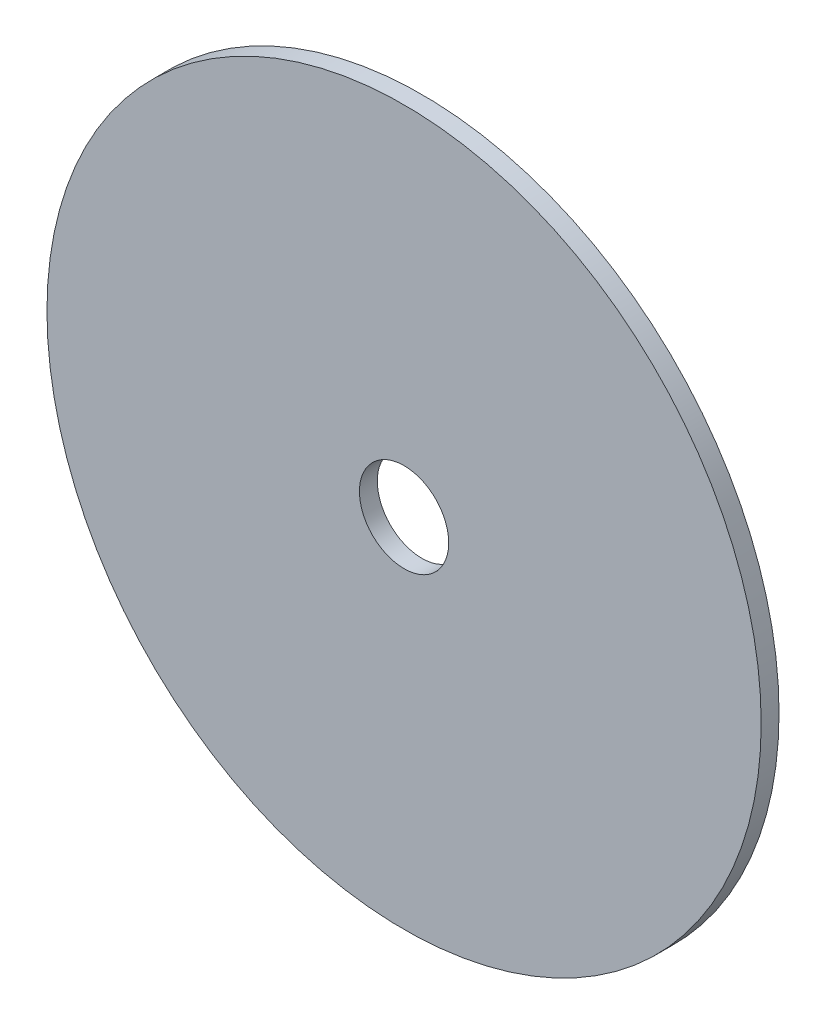
ISO-10303-21;
HEADER;
FILE_DESCRIPTION(('STEP AP214'),'2;1');
FILE_NAME('part.step','',(''),(''),'','','');
FILE_SCHEMA(('AUTOMOTIVE_DESIGN { 1 0 10303 214 1 1 1 1 }'));
ENDSEC;
DATA;
#1=APPLICATION_CONTEXT('core data for automotive mechanical design processes');
#2=APPLICATION_PROTOCOL_DEFINITION('international standard','automotive_design',2000,#1);
#3=PRODUCT_CONTEXT('',#1,'mechanical');
#4=PRODUCT('Part','Part','',(#3));
#5=PRODUCT_RELATED_PRODUCT_CATEGORY('part','',(#4));
#6=PRODUCT_DEFINITION_FORMATION('','',#4);
#7=PRODUCT_DEFINITION_CONTEXT('part definition',#1,'design');
#8=PRODUCT_DEFINITION('design','',#6,#7);
#9=PRODUCT_DEFINITION_SHAPE('','',#8);
#10=(LENGTH_UNIT() NAMED_UNIT(*) SI_UNIT(.MILLI.,.METRE.));
#11=(NAMED_UNIT(*) PLANE_ANGLE_UNIT() SI_UNIT($,.RADIAN.));
#12=(NAMED_UNIT(*) SI_UNIT($,.STERADIAN.) SOLID_ANGLE_UNIT());
#13=UNCERTAINTY_MEASURE_WITH_UNIT(LENGTH_MEASURE(1.E-05),#10,'distance_accuracy_value','');
#14=(GEOMETRIC_REPRESENTATION_CONTEXT(3) GLOBAL_UNCERTAINTY_ASSIGNED_CONTEXT((#13)) GLOBAL_UNIT_ASSIGNED_CONTEXT((#10,
#11,#12)) REPRESENTATION_CONTEXT('',''));
#15=CARTESIAN_POINT('',(0.,0.,0.));
#16=DIRECTION('',(0.,0.,1.));
#17=DIRECTION('',(1.,0.,0.));
#18=AXIS2_PLACEMENT_3D('',#15,#16,#17);
#19=CARTESIAN_POINT('',(0.,0.,2.));
#20=DIRECTION('',(0.,0.,1.));
#21=DIRECTION('',(1.,0.,0.));
#22=AXIS2_PLACEMENT_3D('',#19,#20,#21);
#23=PLANE('',#22);
#24=CARTESIAN_POINT('',(0.,0.,2.));
#25=DIRECTION('',(0.,0.,1.));
#26=DIRECTION('',(1.,0.,0.));
#27=AXIS2_PLACEMENT_3D('',#24,#25,#26);
#28=CIRCLE('',#27,40.);
#29=CARTESIAN_POINT('',(40.,0.,2.));
#30=VERTEX_POINT('',#29);
#31=EDGE_CURVE('E10',#30,#30,#28,.T.);
#32=ORIENTED_EDGE('',*,*,#31,.T.);
#33=EDGE_LOOP('',(#32));
#34=FACE_BOUND('',#33,.T.);
#35=CARTESIAN_POINT('',(0.,0.,2.));
#36=DIRECTION('',(0.,0.,1.));
#37=DIRECTION('',(1.,0.,0.));
#38=AXIS2_PLACEMENT_3D('',#35,#36,#37);
#39=CIRCLE('',#38,5.);
#40=CARTESIAN_POINT('',(5.,0.,2.));
#41=VERTEX_POINT('',#40);
#42=EDGE_CURVE('E50',#41,#41,#39,.T.);
#43=ORIENTED_EDGE('',*,*,#42,.F.);
#44=EDGE_LOOP('',(#43));
#45=FACE_BOUND('',#44,.T.);
#46=ADVANCED_FACE('F39',(#34,#45),#23,.T.);
#47=CARTESIAN_POINT('',(0.,0.,0.));
#48=DIRECTION('',(0.,0.,1.));
#49=DIRECTION('',(1.,0.,0.));
#50=AXIS2_PLACEMENT_3D('',#47,#48,#49);
#51=PLANE('',#50);
#52=CARTESIAN_POINT('',(0.,0.,0.));
#53=DIRECTION('',(0.,0.,1.));
#54=DIRECTION('',(1.,0.,0.));
#55=AXIS2_PLACEMENT_3D('',#52,#53,#54);
#56=CIRCLE('',#55,40.);
#57=CARTESIAN_POINT('',(40.,0.,0.));
#58=VERTEX_POINT('',#57);
#59=EDGE_CURVE('E43',#58,#58,#56,.T.);
#60=ORIENTED_EDGE('',*,*,#59,.F.);
#61=EDGE_LOOP('',(#60));
#62=FACE_BOUND('',#61,.T.);
#63=CARTESIAN_POINT('',(0.,0.,0.));
#64=DIRECTION('',(0.,0.,1.));
#65=DIRECTION('',(1.,0.,0.));
#66=AXIS2_PLACEMENT_3D('',#63,#64,#65);
#67=CIRCLE('',#66,5.);
#68=CARTESIAN_POINT('',(5.,0.,0.));
#69=VERTEX_POINT('',#68);
#70=EDGE_CURVE('E52',#69,#69,#67,.T.);
#71=ORIENTED_EDGE('',*,*,#70,.T.);
#72=EDGE_LOOP('',(#71));
#73=FACE_BOUND('',#72,.T.);
#74=ADVANCED_FACE('F62',(#62,#73),#51,.F.);
#75=CARTESIAN_POINT('',(0.,0.,2.));
#76=DIRECTION('',(0.,0.,-1.));
#77=DIRECTION('',(-1.,0.,0.));
#78=AXIS2_PLACEMENT_3D('',#75,#76,#77);
#79=CYLINDRICAL_SURFACE('',#78,40.);
#80=ORIENTED_EDGE('',*,*,#31,.F.);
#81=EDGE_LOOP('',(#80));
#82=FACE_BOUND('',#81,.T.);
#83=ORIENTED_EDGE('',*,*,#59,.T.);
#84=EDGE_LOOP('',(#83));
#85=FACE_BOUND('',#84,.T.);
#86=ADVANCED_FACE('F41',(#82,#85),#79,.T.);
#87=CARTESIAN_POINT('',(0.,0.,2.));
#88=DIRECTION('',(0.,0.,-1.));
#89=DIRECTION('',(-1.,0.,0.));
#90=AXIS2_PLACEMENT_3D('',#87,#88,#89);
#91=CYLINDRICAL_SURFACE('',#90,5.);
#92=ORIENTED_EDGE('',*,*,#42,.T.);
#93=EDGE_LOOP('',(#92));
#94=FACE_BOUND('',#93,.T.);
#95=ORIENTED_EDGE('',*,*,#70,.F.);
#96=EDGE_LOOP('',(#95));
#97=FACE_BOUND('',#96,.T.);
#98=ADVANCED_FACE('F58',(#94,#97),#91,.F.);
#99=CLOSED_SHELL('',(#46,#74,#86,#98));
#100=MANIFOLD_SOLID_BREP('B2',#99);
#101=ADVANCED_BREP_SHAPE_REPRESENTATION('',(#18,#100),#14);
#102=SHAPE_DEFINITION_REPRESENTATION(#9,#101);
ENDSEC;
END-ISO-10303-21;
